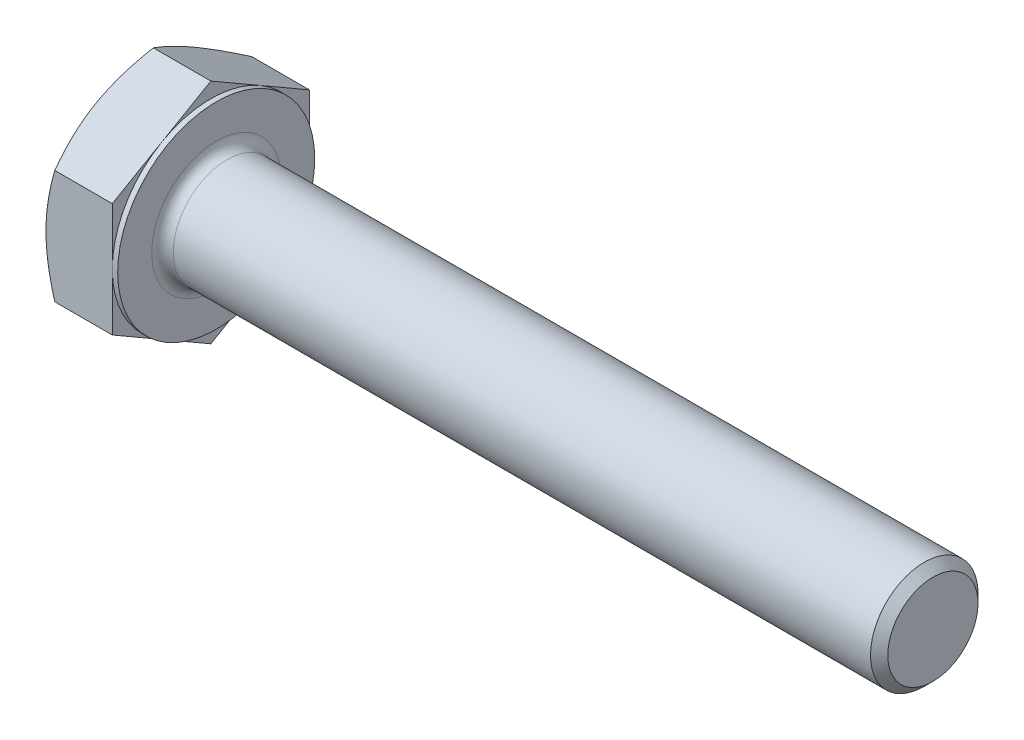
ISO-10303-21;
HEADER;
FILE_DESCRIPTION(('STEP AP214'),'2;1');
FILE_NAME('part.step','',(''),(''),'','','');
FILE_SCHEMA(('AUTOMOTIVE_DESIGN { 1 0 10303 214 1 1 1 1 }'));
ENDSEC;
DATA;
#1=APPLICATION_CONTEXT('core data for automotive mechanical design processes');
#2=APPLICATION_PROTOCOL_DEFINITION('international standard','automotive_design',2000,#1);
#3=PRODUCT_CONTEXT('',#1,'mechanical');
#4=PRODUCT('Part','Part','',(#3));
#5=PRODUCT_RELATED_PRODUCT_CATEGORY('part','',(#4));
#6=PRODUCT_DEFINITION_FORMATION('','',#4);
#7=PRODUCT_DEFINITION_CONTEXT('part definition',#1,'design');
#8=PRODUCT_DEFINITION('design','',#6,#7);
#9=PRODUCT_DEFINITION_SHAPE('','',#8);
#10=(LENGTH_UNIT() NAMED_UNIT(*) SI_UNIT(.MILLI.,.METRE.));
#11=(NAMED_UNIT(*) PLANE_ANGLE_UNIT() SI_UNIT($,.RADIAN.));
#12=(NAMED_UNIT(*) SI_UNIT($,.STERADIAN.) SOLID_ANGLE_UNIT());
#13=UNCERTAINTY_MEASURE_WITH_UNIT(LENGTH_MEASURE(1.E-05),#10,'distance_accuracy_value','');
#14=(GEOMETRIC_REPRESENTATION_CONTEXT(3) GLOBAL_UNCERTAINTY_ASSIGNED_CONTEXT((#13)) GLOBAL_UNIT_ASSIGNED_CONTEXT((#10,
#11,#12)) REPRESENTATION_CONTEXT('',''));
#15=CARTESIAN_POINT('',(0.,0.,0.));
#16=DIRECTION('',(0.,0.,1.));
#17=DIRECTION('',(1.,0.,0.));
#18=AXIS2_PLACEMENT_3D('',#15,#16,#17);
#19=CARTESIAN_POINT('',(8.,12.7017059221718,0.));
#20=DIRECTION('',(1.,0.,0.));
#21=DIRECTION('',(0.,0.,-1.));
#22=AXIS2_PLACEMENT_3D('',#19,#20,#21);
#23=PLANE('',#22);
#24=CARTESIAN_POINT('',(8.,0.,0.));
#25=DIRECTION('',(1.,0.,0.));
#26=DIRECTION('',(0.,0.,-1.));
#27=AXIS2_PLACEMENT_3D('',#24,#25,#26);
#28=CIRCLE('',#27,7.2);
#29=CARTESIAN_POINT('',(8.,0.,-7.2));
#30=VERTEX_POINT('',#29);
#31=EDGE_CURVE('E43',#30,#30,#28,.F.);
#32=ORIENTED_EDGE('',*,*,#31,.T.);
#33=EDGE_LOOP('',(#32));
#34=FACE_BOUND('',#33,.T.);
#35=CARTESIAN_POINT('',(8.,0.,0.));
#36=DIRECTION('',(1.,0.,0.));
#37=DIRECTION('',(0.,0.,-1.));
#38=AXIS2_PLACEMENT_3D('',#35,#36,#37);
#39=CIRCLE('',#38,11.);
#40=CARTESIAN_POINT('',(8.,0.,-11.));
#41=VERTEX_POINT('',#40);
#42=EDGE_CURVE('E294',#41,#41,#39,.T.);
#43=ORIENTED_EDGE('',*,*,#42,.T.);
#44=EDGE_LOOP('',(#43));
#45=FACE_BOUND('',#44,.T.);
#46=ADVANCED_FACE('F35',(#34,#45),#23,.T.);
#47=CARTESIAN_POINT('',(0.,0.,0.));
#48=DIRECTION('',(-1.,0.,0.));
#49=DIRECTION('',(0.,0.,1.));
#50=AXIS2_PLACEMENT_3D('',#47,#48,#49);
#51=CYLINDRICAL_SURFACE('',#50,6.);
#52=CARTESIAN_POINT('',(9.2,0.,0.));
#53=DIRECTION('',(1.,0.,0.));
#54=DIRECTION('',(0.,0.,-1.));
#55=AXIS2_PLACEMENT_3D('',#52,#53,#54);
#56=CIRCLE('',#55,6.);
#57=CARTESIAN_POINT('',(9.2,0.,-6.));
#58=VERTEX_POINT('',#57);
#59=EDGE_CURVE('E11',#58,#58,#56,.T.);
#60=ORIENTED_EDGE('',*,*,#59,.T.);
#61=EDGE_LOOP('',(#60));
#62=FACE_BOUND('',#61,.T.);
#63=CARTESIAN_POINT('',(87.036,0.,0.));
#64=DIRECTION('',(-1.,0.,0.));
#65=DIRECTION('',(0.,0.,1.));
#66=AXIS2_PLACEMENT_3D('',#63,#64,#65);
#67=CIRCLE('',#66,6.);
#68=CARTESIAN_POINT('',(87.036,0.,6.));
#69=VERTEX_POINT('',#68);
#70=EDGE_CURVE('E273',#69,#69,#67,.T.);
#71=ORIENTED_EDGE('',*,*,#70,.T.);
#72=EDGE_LOOP('',(#71));
#73=FACE_BOUND('',#72,.T.);
#74=ADVANCED_FACE('F247',(#62,#73),#51,.T.);
#75=CARTESIAN_POINT('',(88.,0.,0.));
#76=DIRECTION('',(-1.,0.,0.));
#77=DIRECTION('',(0.,0.,1.));
#78=AXIS2_PLACEMENT_3D('',#75,#76,#77);
#79=CONICAL_SURFACE('',#78,5.036,0.785398163397439);
#80=ORIENTED_EDGE('',*,*,#70,.F.);
#81=EDGE_LOOP('',(#80));
#82=FACE_BOUND('',#81,.T.);
#83=CARTESIAN_POINT('',(88.,0.,0.));
#84=DIRECTION('',(-1.,0.,0.));
#85=DIRECTION('',(0.,0.,1.));
#86=AXIS2_PLACEMENT_3D('',#83,#84,#85);
#87=CIRCLE('',#86,5.036);
#88=CARTESIAN_POINT('',(88.,0.,5.036));
#89=VERTEX_POINT('',#88);
#90=EDGE_CURVE('E271',#89,#89,#87,.T.);
#91=ORIENTED_EDGE('',*,*,#90,.T.);
#92=EDGE_LOOP('',(#91));
#93=FACE_BOUND('',#92,.T.);
#94=ADVANCED_FACE('F252',(#82,#93),#79,.T.);
#95=CARTESIAN_POINT('',(88.,0.,0.));
#96=DIRECTION('',(-1.,0.,0.));
#97=DIRECTION('',(0.,0.,1.));
#98=AXIS2_PLACEMENT_3D('',#95,#96,#97);
#99=PLANE('',#98);
#100=ORIENTED_EDGE('',*,*,#90,.F.);
#101=EDGE_LOOP('',(#100));
#102=FACE_BOUND('',#101,.T.);
#103=ADVANCED_FACE('F259',(#102),#99,.F.);
#104=CARTESIAN_POINT('',(7.4,11.,0.));
#105=DIRECTION('',(1.,0.,0.));
#106=DIRECTION('',(0.,0.,-1.));
#107=AXIS2_PLACEMENT_3D('',#104,#105,#106);
#108=PLANE('',#107);
#109=DIRECTION('',(0.,0.500000000000001,0.866025403784438));
#110=VECTOR('',#109,1.);
#111=CARTESIAN_POINT('',(7.4,6.35085296108587,-11.));
#112=LINE('',#111,#110);
#113=CARTESIAN_POINT('',(7.4,6.35085296108587,-11.));
#114=VERTEX_POINT('',#113);
#115=CARTESIAN_POINT('',(7.4,9.52627944162882,-5.50000000000001));
#116=VERTEX_POINT('',#115);
#117=EDGE_CURVE('E167',#114,#116,#112,.T.);
#118=ORIENTED_EDGE('',*,*,#117,.T.);
#119=CARTESIAN_POINT('',(7.4,0.,0.));
#120=DIRECTION('',(-1.,0.,0.));
#121=DIRECTION('',(0.,0.,1.));
#122=AXIS2_PLACEMENT_3D('',#119,#120,#121);
#123=CIRCLE('',#122,11.);
#124=CARTESIAN_POINT('',(7.4,0.,-11.));
#125=VERTEX_POINT('',#124);
#126=EDGE_CURVE('E50',#116,#125,#123,.T.);
#127=ORIENTED_EDGE('',*,*,#126,.T.);
#128=DIRECTION('',(0.,1.,0.));
#129=VECTOR('',#128,1.);
#130=CARTESIAN_POINT('',(7.4,6.35085296108587,-11.));
#131=LINE('',#130,#129);
#132=EDGE_CURVE('E297',#125,#114,#131,.T.);
#133=ORIENTED_EDGE('',*,*,#132,.T.);
#134=EDGE_LOOP('',(#118,#127,#133));
#135=FACE_BOUND('',#134,.T.);
#136=ADVANCED_FACE('F262',(#135),#108,.T.);
#137=CARTESIAN_POINT('',(7.4,12.7017059221718,0.));
#138=VERTEX_POINT('',#137);
#139=EDGE_CURVE('E165',#116,#138,#112,.T.);
#140=ORIENTED_EDGE('',*,*,#139,.T.);
#141=DIRECTION('',(0.,-0.500000000000001,0.866025403784438));
#142=VECTOR('',#141,1.);
#143=CARTESIAN_POINT('',(7.4,12.7017059221718,0.));
#144=LINE('',#143,#142);
#145=CARTESIAN_POINT('',(7.4,9.52627944162882,5.50000000000001));
#146=VERTEX_POINT('',#145);
#147=EDGE_CURVE('E164',#138,#146,#144,.T.);
#148=ORIENTED_EDGE('',*,*,#147,.T.);
#149=EDGE_CURVE('E153',#146,#116,#123,.T.);
#150=ORIENTED_EDGE('',*,*,#149,.T.);
#151=EDGE_LOOP('',(#140,#148,#150));
#152=FACE_BOUND('',#151,.T.);
#153=ADVANCED_FACE('F267',(#152),#108,.T.);
#154=CARTESIAN_POINT('',(7.4,6.35085296108588,11.));
#155=VERTEX_POINT('',#154);
#156=EDGE_CURVE('E132',#146,#155,#144,.T.);
#157=ORIENTED_EDGE('',*,*,#156,.T.);
#158=DIRECTION('',(0.,-1.,0.));
#159=VECTOR('',#158,1.);
#160=CARTESIAN_POINT('',(7.4,6.35085296108588,11.));
#161=LINE('',#160,#159);
#162=CARTESIAN_POINT('',(7.4,0.,11.));
#163=VERTEX_POINT('',#162);
#164=EDGE_CURVE('E126',#155,#163,#161,.T.);
#165=ORIENTED_EDGE('',*,*,#164,.T.);
#166=EDGE_CURVE('E130',#163,#146,#123,.T.);
#167=ORIENTED_EDGE('',*,*,#166,.T.);
#168=EDGE_LOOP('',(#157,#165,#167));
#169=FACE_BOUND('',#168,.T.);
#170=ADVANCED_FACE('F128',(#169),#108,.T.);
#171=CARTESIAN_POINT('',(7.4,-6.35085296108586,11.));
#172=VERTEX_POINT('',#171);
#173=EDGE_CURVE('E136',#163,#172,#161,.T.);
#174=ORIENTED_EDGE('',*,*,#173,.T.);
#175=DIRECTION('',(0.,-0.500000000000002,-0.866025403784438));
#176=VECTOR('',#175,1.);
#177=CARTESIAN_POINT('',(7.4,-12.7017059221718,0.));
#178=LINE('',#177,#176);
#179=CARTESIAN_POINT('',(7.4,-9.52627944162881,5.50000000000002));
#180=VERTEX_POINT('',#179);
#181=EDGE_CURVE('E143',#172,#180,#178,.T.);
#182=ORIENTED_EDGE('',*,*,#181,.T.);
#183=EDGE_CURVE('E140',#180,#163,#123,.T.);
#184=ORIENTED_EDGE('',*,*,#183,.T.);
#185=EDGE_LOOP('',(#174,#182,#184));
#186=FACE_BOUND('',#185,.T.);
#187=ADVANCED_FACE('F141',(#186),#108,.T.);
#188=CARTESIAN_POINT('',(7.4,-12.7017059221718,0.));
#189=VERTEX_POINT('',#188);
#190=EDGE_CURVE('E159',#180,#189,#178,.T.);
#191=ORIENTED_EDGE('',*,*,#190,.T.);
#192=DIRECTION('',(0.,0.5,-0.866025403784439));
#193=VECTOR('',#192,1.);
#194=CARTESIAN_POINT('',(7.4,-6.35085296108589,-11.));
#195=LINE('',#194,#193);
#196=CARTESIAN_POINT('',(7.4,-9.52627944162882,-5.5));
#197=VERTEX_POINT('',#196);
#198=EDGE_CURVE('E335',#189,#197,#195,.T.);
#199=ORIENTED_EDGE('',*,*,#198,.T.);
#200=EDGE_CURVE('E147',#197,#180,#123,.T.);
#201=ORIENTED_EDGE('',*,*,#200,.T.);
#202=EDGE_LOOP('',(#191,#199,#201));
#203=FACE_BOUND('',#202,.T.);
#204=ADVANCED_FACE('F336',(#203),#108,.T.);
#205=CARTESIAN_POINT('',(7.4,-6.35085296108589,-11.));
#206=VERTEX_POINT('',#205);
#207=EDGE_CURVE('E154',#197,#206,#195,.T.);
#208=ORIENTED_EDGE('',*,*,#207,.T.);
#209=EDGE_CURVE('E298',#206,#125,#131,.T.);
#210=ORIENTED_EDGE('',*,*,#209,.T.);
#211=EDGE_CURVE('E305',#125,#197,#123,.T.);
#212=ORIENTED_EDGE('',*,*,#211,.T.);
#213=EDGE_LOOP('',(#208,#210,#212));
#214=FACE_BOUND('',#213,.T.);
#215=ADVANCED_FACE('F268',(#214),#108,.T.);
#216=CARTESIAN_POINT('',(0.,0.,0.));
#217=DIRECTION('',(-1.,0.,0.));
#218=DIRECTION('',(0.,0.,1.));
#219=AXIS2_PLACEMENT_3D('',#216,#217,#218);
#220=CYLINDRICAL_SURFACE('',#219,11.);
#221=ORIENTED_EDGE('',*,*,#126,.F.);
#222=ORIENTED_EDGE('',*,*,#149,.F.);
#223=ORIENTED_EDGE('',*,*,#166,.F.);
#224=ORIENTED_EDGE('',*,*,#183,.F.);
#225=ORIENTED_EDGE('',*,*,#200,.F.);
#226=ORIENTED_EDGE('',*,*,#211,.F.);
#227=EDGE_LOOP('',(#221,#222,#223,#224,#225,#226));
#228=FACE_BOUND('',#227,.T.);
#229=ORIENTED_EDGE('',*,*,#42,.F.);
#230=EDGE_LOOP('',(#229));
#231=FACE_BOUND('',#230,.T.);
#232=ADVANCED_FACE('F150',(#228,#231),#220,.T.);
#233=CARTESIAN_POINT('',(0.,12.7017059221718,0.));
#234=DIRECTION('',(1.,0.,0.));
#235=DIRECTION('',(0.,0.,-1.));
#236=AXIS2_PLACEMENT_3D('',#233,#234,#235);
#237=PLANE('',#236);
#238=CARTESIAN_POINT('',(0.,0.,0.));
#239=DIRECTION('',(1.,0.,0.));
#240=DIRECTION('',(0.,0.,-1.));
#241=AXIS2_PLACEMENT_3D('',#238,#239,#240);
#242=CIRCLE('',#241,11.);
#243=CARTESIAN_POINT('',(0.,0.,-11.));
#244=VERTEX_POINT('',#243);
#245=CARTESIAN_POINT('',(0.,9.52627944162882,-5.50000000000001));
#246=VERTEX_POINT('',#245);
#247=EDGE_CURVE('E293',#244,#246,#242,.T.);
#248=ORIENTED_EDGE('',*,*,#247,.F.);
#249=CARTESIAN_POINT('',(0.,-9.52627944162883,-5.5));
#250=VERTEX_POINT('',#249);
#251=EDGE_CURVE('E289',#250,#244,#242,.T.);
#252=ORIENTED_EDGE('',*,*,#251,.F.);
#253=CARTESIAN_POINT('',(0.,-9.52627944162881,5.50000000000002));
#254=VERTEX_POINT('',#253);
#255=EDGE_CURVE('E292',#254,#250,#242,.T.);
#256=ORIENTED_EDGE('',*,*,#255,.F.);
#257=CARTESIAN_POINT('',(0.,0.,11.));
#258=VERTEX_POINT('',#257);
#259=EDGE_CURVE('E328',#258,#254,#242,.T.);
#260=ORIENTED_EDGE('',*,*,#259,.F.);
#261=CARTESIAN_POINT('',(0.,0.,0.));
#262=DIRECTION('',(-1.,0.,0.));
#263=DIRECTION('',(0.,0.,1.));
#264=AXIS2_PLACEMENT_3D('',#261,#262,#263);
#265=CIRCLE('',#264,11.);
#266=CARTESIAN_POINT('',(0.,9.52627944162882,5.50000000000001));
#267=VERTEX_POINT('',#266);
#268=EDGE_CURVE('E168',#258,#267,#265,.T.);
#269=ORIENTED_EDGE('',*,*,#268,.T.);
#270=EDGE_CURVE('E351',#246,#267,#242,.T.);
#271=ORIENTED_EDGE('',*,*,#270,.F.);
#272=EDGE_LOOP('',(#248,#252,#256,#260,#269,#271));
#273=FACE_BOUND('',#272,.T.);
#274=ADVANCED_FACE('F197',(#273),#237,.F.);
#275=CARTESIAN_POINT('',(0.,0.,0.));
#276=DIRECTION('',(1.,0.,0.));
#277=DIRECTION('',(0.,0.,-1.));
#278=AXIS2_PLACEMENT_3D('',#275,#276,#277);
#279=CONICAL_SURFACE('',#278,11.,1.0471975511966);
#280=CARTESIAN_POINT('',(0.982547039823191,6.35073749103204,11.0002));
#281=CARTESIAN_POINT('',(0.901959155335525,6.49034297195856,10.7583962140202));
#282=CARTESIAN_POINT('',(0.825028921497374,6.63046897390005,10.515690859196));
#283=CARTESIAN_POINT('',(0.679498643319587,6.91184468290416,10.0283338351852));
#284=CARTESIAN_POINT('',(0.610901338761565,7.05309474336861,9.78368155388858));
#285=CARTESIAN_POINT('',(0.418936354542192,7.47912088225752,9.0457826359806));
#286=CARTESIAN_POINT('',(0.309747721904761,7.7655787550001,8.54962304616236));
#287=CARTESIAN_POINT('',(0.181714117195322,8.19424982761043,7.80714296866621));
#288=CARTESIAN_POINT('',(0.145242204444723,8.33518236221488,7.56304065829185));
#289=CARTESIAN_POINT('',(0.0840813064430235,8.61769996304406,7.07370581962324));
#290=CARTESIAN_POINT('',(0.0593925479828354,8.75928504177541,6.82847326966692));
#291=CARTESIAN_POINT('',(0.0224303476738595,9.04269125210811,6.33759931419013));
#292=CARTESIAN_POINT('',(0.0101421523103371,9.18451190164691,6.0919587436265));
#293=CARTESIAN_POINT('',(-0.00175707301040475,9.468284615191,5.60044998596645));
#294=CARTESIAN_POINT('',(-0.00136849465552234,9.61023667500044,5.35458180613745));
#295=CARTESIAN_POINT('',(0.0112011693743153,9.87561687613281,4.89492981445334));
#296=CARTESIAN_POINT('',(0.0218490320051213,9.99906394230749,4.68111322379348));
#297=CARTESIAN_POINT('',(0.0525316277921012,10.2456741483142,4.25397181732485));
#298=CARTESIAN_POINT('',(0.0725670249420614,10.3688372674429,4.04064703737531));
#299=CARTESIAN_POINT('',(0.121675385698741,10.6148126455581,3.6146051850688));
#300=CARTESIAN_POINT('',(0.150755814007044,10.7376245298813,3.4018887616477));
#301=CARTESIAN_POINT('',(0.217443999362303,10.9826725251415,2.97745318356423));
#302=CARTESIAN_POINT('',(0.25505233601821,11.1049085963659,2.76573409768589));
#303=CARTESIAN_POINT('',(0.381619916344573,11.4759630865849,2.12304886825007));
#304=CARTESIAN_POINT('',(0.483199458479366,11.7237069719422,1.69394387154657));
#305=CARTESIAN_POINT('',(0.713743699662927,12.2155005006248,0.842132493034879));
#306=CARTESIAN_POINT('',(0.84265425180754,12.4595564409434,0.419415204514));
#307=CARTESIAN_POINT('',(0.982547039823199,12.7018213922256,-0.000199999999999214));
#308=B_SPLINE_CURVE_WITH_KNOTS('',3,(#280,#281,#282,#283,#284,#285,#286,#287,#288,#289,#290,
#291,#292,#293,#294,#295,#296,#297,#298,#299,#300,#301,#302,#303,#304,#305,#306,#307),
.UNSPECIFIED.,.F.,.F.,(4,2,2,2,2,2,2,2,2,2,2,2,2,4),(0.,0.871755124656707,1.74379610209014,
3.49159027742165,4.34403665487447,5.19649943874035,6.0479468088217,6.89936787084372,
7.64056020263244,8.38180496793424,9.1236630996721,9.86557166775903,11.3820155381851,
12.8954827156567),.UNSPECIFIED.);
#309=CARTESIAN_POINT('',(0.98248037224745,12.7017059221718,0.));
#310=VERTEX_POINT('',#309);
#311=EDGE_CURVE('E216',#267,#310,#308,.T.);
#312=ORIENTED_EDGE('',*,*,#311,.T.);
#313=CARTESIAN_POINT('',(0.9825470398232,12.7018213922256,0.0002));
#314=CARTESIAN_POINT('',(0.901959155335534,12.5622159112991,-0.241603785979829));
#315=CARTESIAN_POINT('',(0.825028921497383,12.4220899093576,-0.484309140803984));
#316=CARTESIAN_POINT('',(0.679498643319595,12.1407142003535,-0.971666164814806));
#317=CARTESIAN_POINT('',(0.610901338761574,11.999464139889,-1.21631844611142));
#318=CARTESIAN_POINT('',(0.418936354542199,11.5734380010001,-1.9542173640194));
#319=CARTESIAN_POINT('',(0.309747721904765,11.2869801282576,-2.45037695383764));
#320=CARTESIAN_POINT('',(0.181714117195326,10.8583090556472,-3.19285703133379));
#321=CARTESIAN_POINT('',(0.145242204444727,10.7173765210428,-3.43695934170814));
#322=CARTESIAN_POINT('',(0.0840813064430262,10.4348589202136,-3.92629418037676));
#323=CARTESIAN_POINT('',(0.0593925479828372,10.2932738414822,-4.17152673033309));
#324=CARTESIAN_POINT('',(0.0224303476738606,10.0098676311495,-4.66240068580987));
#325=CARTESIAN_POINT('',(0.0101421523103383,9.86804698161074,-4.9080412563735));
#326=CARTESIAN_POINT('',(-0.00175707301040444,9.58427426806665,-5.39955001403355));
#327=CARTESIAN_POINT('',(-0.00136849465552313,9.44232220825721,-5.64541819386255));
#328=CARTESIAN_POINT('',(0.0112011693743136,9.17694200712484,-6.10507018554666));
#329=CARTESIAN_POINT('',(0.0218490320051198,9.05349494095016,-6.31888677620652));
#330=CARTESIAN_POINT('',(0.0525316277920992,8.80688473494347,-6.74602818267515));
#331=CARTESIAN_POINT('',(0.0725670249420589,8.68372161581478,-6.95935296262469));
#332=CARTESIAN_POINT('',(0.121675385698738,8.43774623769957,-7.3853948149312));
#333=CARTESIAN_POINT('',(0.15075581400704,8.31493435337634,-7.5981112383523));
#334=CARTESIAN_POINT('',(0.217443999362299,8.06988635811619,-8.02254681643577));
#335=CARTESIAN_POINT('',(0.255052336018205,7.94765028689175,-8.23426590231411));
#336=CARTESIAN_POINT('',(0.381619916344568,7.57659579667278,-8.87695113174993));
#337=CARTESIAN_POINT('',(0.483199458479359,7.32885191131541,-9.30605612845343));
#338=CARTESIAN_POINT('',(0.713743699662918,6.83705838263289,-10.1578675069651));
#339=CARTESIAN_POINT('',(0.842654251807531,6.59300244231425,-10.580584795486));
#340=CARTESIAN_POINT('',(0.982547039823192,6.35073749103204,-11.0002));
#341=B_SPLINE_CURVE_WITH_KNOTS('',3,(#313,#314,#315,#316,#317,#318,#319,#320,#321,#322,#323,
#324,#325,#326,#327,#328,#329,#330,#331,#332,#333,#334,#335,#336,#337,#338,#339,#340),
.UNSPECIFIED.,.F.,.F.,(4,2,2,2,2,2,2,2,2,2,2,2,2,4),(0.,0.871755124656707,1.74379610209014,
3.49159027742166,4.34403665487447,5.19649943874036,6.0479468088217,6.89936787084373,
7.64056020263245,8.38180496793425,9.12366309967211,9.86557166775903,11.3820155381851,
12.8954827156567),.UNSPECIFIED.);
#342=EDGE_CURVE('E58',#310,#246,#341,.T.);
#343=ORIENTED_EDGE('',*,*,#342,.T.);
#344=ORIENTED_EDGE('',*,*,#270,.T.);
#345=EDGE_LOOP('',(#312,#343,#344));
#346=FACE_BOUND('',#345,.T.);
#347=ADVANCED_FACE('F352',(#346),#279,.T.);
#348=CARTESIAN_POINT('',(5.45962897935432,-17.2470997850768,11.));
#349=CARTESIAN_POINT('',(5.34231348623165,-17.0060889518646,11.));
#350=CARTESIAN_POINT('',(5.22556892482358,-16.7648003390627,11.));
#351=CARTESIAN_POINT('',(4.99335060595058,-16.2816096545103,11.));
#352=CARTESIAN_POINT('',(4.87787686070189,-16.03970757689,11.));
#353=CARTESIAN_POINT('',(4.5335260225219,-15.3129324281348,11.));
#354=CARTESIAN_POINT('',(4.30675273072213,-14.8270588812377,11.));
#355=CARTESIAN_POINT('',(3.85897116853181,-13.8495672244361,11.));
#356=CARTESIAN_POINT('',(3.63799941464739,-13.3579323474887,11.));
#357=CARTESIAN_POINT('',(3.20484722410655,-12.3708181940388,11.));
#358=CARTESIAN_POINT('',(2.99266638443466,-11.875339095012,11.));
#359=CARTESIAN_POINT('',(2.57247367919091,-10.8630233950126,11.));
#360=CARTESIAN_POINT('',(2.36484130082578,-10.3460284712597,11.));
#361=CARTESIAN_POINT('',(1.96483982306432,-9.30605625666137,11.));
#362=CARTESIAN_POINT('',(1.77247241026768,-8.78307831204595,11.));
#363=CARTESIAN_POINT('',(1.40791696455449,-7.73124436817154,11.));
#364=CARTESIAN_POINT('',(1.23568964638714,-7.2024020922387,11.));
#365=CARTESIAN_POINT('',(0.91680574828924,-6.13708404570501,11.));
#366=CARTESIAN_POINT('',(0.770141309994957,-5.60061067604935,11.));
#367=CARTESIAN_POINT('',(0.574935442743972,-4.79156898952362,11.));
#368=CARTESIAN_POINT('',(0.514137021876882,-4.52194135151204,11.));
#369=CARTESIAN_POINT('',(0.401508435345234,-3.98080971915151,11.));
#370=CARTESIAN_POINT('',(0.349678094887422,-3.70930576148044,11.));
#371=CARTESIAN_POINT('',(0.255888593165524,-3.16459510241603,11.));
#372=CARTESIAN_POINT('',(0.213929236462788,-2.89138843484512,11.));
#373=CARTESIAN_POINT('',(0.140711189296341,-2.34354612758117,11.));
#374=CARTESIAN_POINT('',(0.109452068415435,-2.06891054581749,11.));
#375=CARTESIAN_POINT('',(0.0586581415230971,-1.52226131984006,11.));
#376=CARTESIAN_POINT('',(0.0389718884451943,-1.25026183527092,11.));
#377=CARTESIAN_POINT('',(0.0111284010141502,-0.705673996301283,11.));
#378=CARTESIAN_POINT('',(0.00297097006206761,-0.433085652021906,11.));
#379=CARTESIAN_POINT('',(-0.0016198739465194,0.112191853840743,11.));
#380=CARTESIAN_POINT('',(0.00194669894006209,0.384881015302746,11.));
#381=CARTESIAN_POINT('',(0.0207143970443333,0.929861561068674,11.));
#382=CARTESIAN_POINT('',(0.0359160573832307,1.20215292650004,11.));
#383=CARTESIAN_POINT('',(0.0856729787465039,1.85095047440591,11.));
#384=CARTESIAN_POINT('',(0.125437121633999,2.22706614776121,11.));
#385=CARTESIAN_POINT('',(0.225037478525136,2.97661036121123,11.));
#386=CARTESIAN_POINT('',(0.284876266728091,3.35003855041006,11.));
#387=CARTESIAN_POINT('',(0.491340522059922,4.46580768665092,11.));
#388=CARTESIAN_POINT('',(0.664879654325623,5.20324026094175,11.));
#389=CARTESIAN_POINT('',(0.96714399211498,6.3061295691042,11.));
#390=CARTESIAN_POINT('',(1.07633089919387,6.67727137954583,11.));
#391=CARTESIAN_POINT('',(1.30638118501142,7.41595393527288,11.));
#392=CARTESIAN_POINT('',(1.42724464423454,7.78349465571738,11.));
#393=CARTESIAN_POINT('',(1.67868115165415,8.51508385863158,11.));
#394=CARTESIAN_POINT('',(1.80925124223601,8.87913336701398,11.));
#395=CARTESIAN_POINT('',(2.07853139559134,9.60419404051376,11.));
#396=CARTESIAN_POINT('',(2.21724134094991,9.96520524937182,11.));
#397=CARTESIAN_POINT('',(2.56570983011627,10.8471449233791,11.));
#398=CARTESIAN_POINT('',(2.7792374206319,11.366581815061,11.));
#399=CARTESIAN_POINT('',(3.21741982618343,12.4007561844022,11.));
#400=CARTESIAN_POINT('',(3.44207546585639,12.9154933104307,11.));
#401=CARTESIAN_POINT('',(3.90018345618556,13.9411926358306,11.));
#402=CARTESIAN_POINT('',(4.13363815526232,14.452153783265,11.));
#403=CARTESIAN_POINT('',(4.60748399230414,15.4708244590252,11.));
#404=CARTESIAN_POINT('',(4.84787494923999,15.9785340717909,11.));
#405=CARTESIAN_POINT('',(5.33454416659782,16.991900203434,11.));
#406=CARTESIAN_POINT('',(5.58082941367991,17.4975533606732,11.));
#407=CARTESIAN_POINT('',(6.07795337147829,18.5066162614648,11.));
#408=CARTESIAN_POINT('',(6.3287921061177,19.0100259932134,11.));
#409=CARTESIAN_POINT('',(6.83417262370027,20.0148835366254,11.));
#410=CARTESIAN_POINT('',(7.0887138275232,20.5163316398723,11.));
#411=CARTESIAN_POINT('',(7.60090805557973,21.5176369665699,11.));
#412=CARTESIAN_POINT('',(7.85856109256177,22.0174941834924,11.));
#413=CARTESIAN_POINT('',(8.58894371196248,23.425462327732,11.));
#414=CARTESIAN_POINT('',(9.06467784043081,24.3320145304321,11.));
#415=CARTESIAN_POINT('',(10.0225256617149,26.1417834952498,11.));
#416=CARTESIAN_POINT('',(10.5046396248099,27.04500011397,11.));
#417=CARTESIAN_POINT('',(11.4723649577538,28.8463130553615,11.));
#418=CARTESIAN_POINT('',(11.9579628331135,29.744416632715,11.));
#419=CARTESIAN_POINT('',(12.6891583734937,31.0900134257858,11.));
#420=CARTESIAN_POINT('',(12.9333491720225,31.5382722573939,11.));
#421=CARTESIAN_POINT('',(13.4225690770987,32.4343313922787,11.));
#422=CARTESIAN_POINT('',(13.6675981823792,32.882131696247,11.));
#423=CARTESIAN_POINT('',(13.9129970850526,33.3297293129898,11.));
#424=B_SPLINE_CURVE_WITH_KNOTS('',3,(#348,#349,#350,#351,#352,#353,#354,#355,#356,#357,#358,
#359,#360,#361,#362,#363,#364,#365,#366,#367,#368,#369,#370,#371,#372,#373,#374,#375,#376,#377,
#378,#379,#380,#381,#382,#383,#384,#385,#386,#387,#388,#389,#390,#391,#392,#393,#394,#395,#396,
#397,#398,#399,#400,#401,#402,#403,#404,#405,#406,#407,#408,#409,#410,#411,#412,#413,#414,#415,
#416,#417,#418,#419,#420,#421,#422,#423),.UNSPECIFIED.,.F.,.F.,(4,2,2,2,2,2,2,2,2,2,2,2,2,2,2,2,
2,2,2,2,2,2,2,2,2,2,2,2,2,2,2,2,2,2,2,2,2,4),(0.,0.804139336623751,1.60828639662063,
3.21680897448121,4.83377623759865,6.45066928937426,8.12187818876223,9.7932714807813,
11.4613481630707,13.1289111488456,13.9579782914284,14.7870292731757,15.6160638389051,
16.445065052783,17.2629611429282,18.0808432854694,18.8987244473819,19.716643227564,
20.8506417292814,21.9847857008002,24.2542515847469,25.4147583491649,26.575273113328,
27.7354357061756,28.8955815681455,30.5802397695547,32.2650229988083,33.9502591165867,
35.6354512911452,37.3227509574432,39.0100594910421,40.6971068839486,42.3841611906352,
45.4555127256885,48.5269947965539,51.5899154254046,53.1212821755916,54.652646612437),.UNSPECIFIED.);
#425=CARTESIAN_POINT('',(0.98248037224744,6.35085296108588,11.));
#426=VERTEX_POINT('',#425);
#427=EDGE_CURVE('E228',#258,#426,#424,.T.);
#428=ORIENTED_EDGE('',*,*,#427,.T.);
#429=EDGE_CURVE('E227',#426,#267,#308,.T.);
#430=ORIENTED_EDGE('',*,*,#429,.T.);
#431=ORIENTED_EDGE('',*,*,#268,.F.);
#432=EDGE_LOOP('',(#428,#430,#431));
#433=FACE_BOUND('',#432,.T.);
#434=ADVANCED_FACE('F322',(#433),#279,.T.);
#435=CARTESIAN_POINT('',(0.982480372247436,-6.35085296108586,11.));
#436=VERTEX_POINT('',#435);
#437=EDGE_CURVE('E274',#436,#258,#424,.T.);
#438=ORIENTED_EDGE('',*,*,#437,.T.);
#439=ORIENTED_EDGE('',*,*,#259,.T.);
#440=CARTESIAN_POINT('',(0.982547039823196,-12.7018213922256,-0.000200000000000038));
#441=CARTESIAN_POINT('',(0.901959155335529,-12.5622159112991,0.241603785979828));
#442=CARTESIAN_POINT('',(0.825028921497378,-12.4220899093576,0.484309140803982));
#443=CARTESIAN_POINT('',(0.679498643319591,-12.1407142003535,0.971666164814804));
#444=CARTESIAN_POINT('',(0.610901338761569,-11.999464139889,1.21631844611141));
#445=CARTESIAN_POINT('',(0.418936354542195,-11.5734380010001,1.9542173640194));
#446=CARTESIAN_POINT('',(0.309747721904761,-11.2869801282575,2.45037695383764));
#447=CARTESIAN_POINT('',(0.181714117195321,-10.8583090556472,3.19285703133378));
#448=CARTESIAN_POINT('',(0.145242204444722,-10.7173765210428,3.43695934170814));
#449=CARTESIAN_POINT('',(0.0840813064430204,-10.4348589202136,3.92629418037675));
#450=CARTESIAN_POINT('',(0.0593925479828312,-10.2932738414822,4.17152673033308));
#451=CARTESIAN_POINT('',(0.0224303476738547,-10.0098676311495,4.66240068580987));
#452=CARTESIAN_POINT('',(0.0101421523103328,-9.86804698161073,4.9080412563735));
#453=CARTESIAN_POINT('',(-0.00175707301040996,-9.58427426806664,5.39955001403354));
#454=CARTESIAN_POINT('',(-0.00136849465552902,-9.4423222082572,5.64541819386254));
#455=CARTESIAN_POINT('',(0.0112011693743066,-9.17694200712483,6.10507018554666));
#456=CARTESIAN_POINT('',(0.021849032005112,-9.05349494095015,6.31888677620652));
#457=CARTESIAN_POINT('',(0.0525316277920915,-8.80688473494345,6.74602818267514));
#458=CARTESIAN_POINT('',(0.0725670249420518,-8.68372161581477,6.95935296262468));
#459=CARTESIAN_POINT('',(0.121675385698731,-8.43774623769956,7.3853948149312));
#460=CARTESIAN_POINT('',(0.150755814007034,-8.31493435337633,7.5981112383523));
#461=CARTESIAN_POINT('',(0.217443999362292,-8.06988635811618,8.02254681643577));
#462=CARTESIAN_POINT('',(0.255052336018197,-7.94765028689174,8.23426590231411));
#463=CARTESIAN_POINT('',(0.381619916344559,-7.57659579667277,8.87695113174993));
#464=CARTESIAN_POINT('',(0.483199458479352,-7.32885191131539,9.30605612845342));
#465=CARTESIAN_POINT('',(0.713743699662913,-6.83705838263288,10.1578675069651));
#466=CARTESIAN_POINT('',(0.842654251807526,-6.59300244231424,10.580584795486));
#467=CARTESIAN_POINT('',(0.982547039823186,-6.35073749103202,11.0002));
#468=B_SPLINE_CURVE_WITH_KNOTS('',3,(#440,#441,#442,#443,#444,#445,#446,#447,#448,#449,#450,
#451,#452,#453,#454,#455,#456,#457,#458,#459,#460,#461,#462,#463,#464,#465,#466,#467),
.UNSPECIFIED.,.F.,.F.,(4,2,2,2,2,2,2,2,2,2,2,2,2,4),(0.,0.871755124656706,1.74379610209014,
3.49159027742165,4.34403665487447,5.19649943874035,6.0479468088217,6.89936787084372,
7.64056020263245,8.38180496793425,9.12366309967211,9.86557166775903,11.3820155381851,
12.8954827156567),.UNSPECIFIED.);
#469=EDGE_CURVE('E218',#254,#436,#468,.T.);
#470=ORIENTED_EDGE('',*,*,#469,.T.);
#471=EDGE_LOOP('',(#438,#439,#470));
#472=FACE_BOUND('',#471,.T.);
#473=ADVANCED_FACE('F186',(#472),#279,.T.);
#474=CARTESIAN_POINT('',(0.982480372247447,-12.7017059221718,0.));
#475=VERTEX_POINT('',#474);
#476=EDGE_CURVE('E211',#475,#254,#468,.T.);
#477=ORIENTED_EDGE('',*,*,#476,.T.);
#478=ORIENTED_EDGE('',*,*,#255,.T.);
#479=CARTESIAN_POINT('',(0.982547039823196,-6.35073749103205,-11.0002));
#480=CARTESIAN_POINT('',(0.90195915533553,-6.49034297195858,-10.7583962140202));
#481=CARTESIAN_POINT('',(0.82502892149738,-6.63046897390007,-10.515690859196));
#482=CARTESIAN_POINT('',(0.679498643319592,-6.91184468290417,-10.0283338351852));
#483=CARTESIAN_POINT('',(0.61090133876157,-7.05309474336862,-9.78368155388858));
#484=CARTESIAN_POINT('',(0.418936354542196,-7.47912088225753,-9.0457826359806));
#485=CARTESIAN_POINT('',(0.309747721904764,-7.76557875500011,-8.54962304616236));
#486=CARTESIAN_POINT('',(0.181714117195326,-8.19424982761044,-7.80714296866621));
#487=CARTESIAN_POINT('',(0.145242204444727,-8.33518236221489,-7.56304065829185));
#488=CARTESIAN_POINT('',(0.0840813064430265,-8.61769996304407,-7.07370581962324));
#489=CARTESIAN_POINT('',(0.0593925479828378,-8.75928504177542,-6.82847326966691));
#490=CARTESIAN_POINT('',(0.0224303476738616,-9.04269125210812,-6.33759931419012));
#491=CARTESIAN_POINT('',(0.0101421523103395,-9.18451190164692,-6.09195874362649));
#492=CARTESIAN_POINT('',(-0.00175707301040221,-9.46828461519101,-5.60044998596645));
#493=CARTESIAN_POINT('',(-0.00136849465552012,-9.61023667500044,-5.35458180613745));
#494=CARTESIAN_POINT('',(0.0112011693743166,-9.87561687613281,-4.89492981445333));
#495=CARTESIAN_POINT('',(0.0218490320051222,-9.99906394230749,-4.68111322379347));
#496=CARTESIAN_POINT('',(0.0525316277921022,-10.2456741483142,-4.25397181732485));
#497=CARTESIAN_POINT('',(0.072567024942063,-10.3688372674429,-4.04064703737531));
#498=CARTESIAN_POINT('',(0.121675385698743,-10.6148126455581,-3.6146051850688));
#499=CARTESIAN_POINT('',(0.150755814007045,-10.7376245298813,-3.4018887616477));
#500=CARTESIAN_POINT('',(0.217443999362303,-10.9826725251415,-2.97745318356422));
#501=CARTESIAN_POINT('',(0.255052336018209,-11.1049085963659,-2.76573409768589));
#502=CARTESIAN_POINT('',(0.381619916344572,-11.4759630865849,-2.12304886825007));
#503=CARTESIAN_POINT('',(0.483199458479365,-11.7237069719422,-1.69394387154657));
#504=CARTESIAN_POINT('',(0.713743699662925,-12.2155005006248,-0.842132493034879));
#505=CARTESIAN_POINT('',(0.842654251807537,-12.4595564409434,-0.419415204514001));
#506=CARTESIAN_POINT('',(0.982547039823196,-12.7018213922256,0.000199999999999387));
#507=B_SPLINE_CURVE_WITH_KNOTS('',3,(#479,#480,#481,#482,#483,#484,#485,#486,#487,#488,#489,
#490,#491,#492,#493,#494,#495,#496,#497,#498,#499,#500,#501,#502,#503,#504,#505,#506),
.UNSPECIFIED.,.F.,.F.,(4,2,2,2,2,2,2,2,2,2,2,2,2,4),(0.,0.871755124656708,1.74379610209014,
3.49159027742166,4.34403665487447,5.19649943874035,6.0479468088217,6.89936787084373,
7.64056020263245,8.38180496793424,9.1236630996721,9.86557166775902,11.3820155381851,
12.8954827156567),.UNSPECIFIED.);
#508=EDGE_CURVE('E217',#250,#475,#507,.T.);
#509=ORIENTED_EDGE('',*,*,#508,.T.);
#510=EDGE_LOOP('',(#477,#478,#509));
#511=FACE_BOUND('',#510,.T.);
#512=ADVANCED_FACE('F350',(#511),#279,.T.);
#513=CARTESIAN_POINT('',(0.982480372247442,6.35085296108587,-11.));
#514=VERTEX_POINT('',#513);
#515=EDGE_CURVE('E219',#246,#514,#341,.T.);
#516=ORIENTED_EDGE('',*,*,#515,.T.);
#517=CARTESIAN_POINT('',(5.45962897683115,-17.2470997798933,-11.));
#518=CARTESIAN_POINT('',(5.3423134837611,-17.0060889467683,-11.));
#519=CARTESIAN_POINT('',(5.22556892240561,-16.7648003340536,-11.));
#520=CARTESIAN_POINT('',(4.99335060363771,-16.2816096496756,-11.));
#521=CARTESIAN_POINT('',(4.87787685844152,-16.0397075721426,-11.));
#522=CARTESIAN_POINT('',(4.53352602041888,-15.3129324236495,-11.));
#523=CARTESIAN_POINT('',(4.30675272872375,-14.8270588769274,-11.));
#524=CARTESIAN_POINT('',(3.85897116674279,-13.8495672204784,-11.));
#525=CARTESIAN_POINT('',(3.63799941296306,-13.3579323437087,-11.));
#526=CARTESIAN_POINT('',(3.20484722262988,-12.3708181906152,-11.));
#527=CARTESIAN_POINT('',(2.99266638306095,-11.8753390917673,-11.));
#528=CARTESIAN_POINT('',(2.57247367802624,-10.8630233921397,-11.));
#529=CARTESIAN_POINT('',(2.36484129976693,-10.3460284685799,-11.));
#530=CARTESIAN_POINT('',(1.96483982221148,-9.30605625437088,-11.));
#531=CARTESIAN_POINT('',(1.77247240951503,-8.78307830995168,-11.));
#532=CARTESIAN_POINT('',(1.40791696399265,-7.73124436647331,-11.));
#533=CARTESIAN_POINT('',(1.23568964591595,-7.20240209074028,-11.));
#534=CARTESIAN_POINT('',(0.916805747984619,-6.13708404461173,-11.));
#535=CARTESIAN_POINT('',(0.77014130976626,-5.60061067516138,-11.));
#536=CARTESIAN_POINT('',(0.57493544262423,-4.79156898899759,-11.));
#537=CARTESIAN_POINT('',(0.514137021797096,-4.52194135114064,-11.));
#538=CARTESIAN_POINT('',(0.401508435335246,-3.98080971909158,-11.));
#539=CARTESIAN_POINT('',(0.349678094907276,-3.70930576157735,-11.));
#540=CARTESIAN_POINT('',(0.255888593233352,-3.16459510282835,-11.));
#541=CARTESIAN_POINT('',(0.213929236548754,-2.89138843541601,-11.));
#542=CARTESIAN_POINT('',(0.140711189405543,-2.34354612847057,-11.));
#543=CARTESIAN_POINT('',(0.109452068529736,-2.06891054686683,-11.));
#544=CARTESIAN_POINT('',(0.0586581416334424,-1.52226132120592,-11.));
#545=CARTESIAN_POINT('',(0.0389718885467467,-1.25026183679334,-11.));
#546=CARTESIAN_POINT('',(0.0111284010842726,-0.705673998136546,-11.));
#547=CARTESIAN_POINT('',(0.00297097010955307,-0.433085654013441,-11.));
#548=CARTESIAN_POINT('',(-0.00161987395784271,0.11219185153782,-11.));
#549=CARTESIAN_POINT('',(0.00194669889256435,0.384881012844706,-11.));
#550=CARTESIAN_POINT('',(0.0207143969119022,0.929861558302418,-11.));
#551=CARTESIAN_POINT('',(0.0359160572020394,1.20215292358069,-11.));
#552=CARTESIAN_POINT('',(0.0856729784453964,1.85095047125051,-11.));
#553=CARTESIAN_POINT('',(0.125437121263892,2.22706614452355,-11.));
#554=CARTESIAN_POINT('',(0.225037478013344,2.97661035781277,-11.));
#555=CARTESIAN_POINT('',(0.284876266143613,3.35003854693308,-11.));
#556=CARTESIAN_POINT('',(0.491340521255872,4.46580768294265,-11.));
#557=CARTESIAN_POINT('',(0.664879653373268,5.20324025708537,-11.));
#558=CARTESIAN_POINT('',(0.967143990943863,6.30612956502636,-11.));
#559=CARTESIAN_POINT('',(1.07633089794937,6.67727137539264,-11.));
#560=CARTESIAN_POINT('',(1.3063811836224,7.41595393096985,-11.));
#561=CARTESIAN_POINT('',(1.42724464277439,7.78349465133984,-11.));
#562=CARTESIAN_POINT('',(1.67868115005429,8.51508385410558,-11.));
#563=CARTESIAN_POINT('',(1.80925124056757,8.87913336241403,-11.));
#564=CARTESIAN_POINT('',(2.07853139378813,9.60419403576588,-11.));
#565=CARTESIAN_POINT('',(2.21724133908051,9.96520524454998,-11.));
#566=CARTESIAN_POINT('',(2.5657098281399,10.8471449185089,-11.));
#567=CARTESIAN_POINT('',(2.77923741861963,11.3665818102149,-11.));
#568=CARTESIAN_POINT('',(3.21741982410827,12.4007561796013,-11.));
#569=CARTESIAN_POINT('',(3.44207546375422,12.915493305651,-11.));
#570=CARTESIAN_POINT('',(3.90018345403612,13.9411926310911,-11.));
#571=CARTESIAN_POINT('',(4.13363815309263,14.4521537785445,-11.));
#572=CARTESIAN_POINT('',(4.60748399009892,15.4708244543406,-11.));
#573=CARTESIAN_POINT('',(4.8478749470195,15.9785340671233,-11.));
#574=CARTESIAN_POINT('',(5.33454416435099,16.9919001987996,-11.));
#575=CARTESIAN_POINT('',(5.58082941142201,17.497553356055,-11.));
#576=CARTESIAN_POINT('',(6.0779533692012,18.5066162568778,-11.));
#577=CARTESIAN_POINT('',(6.32879210383249,19.0100259886413,-11.));
#578=CARTESIAN_POINT('',(6.83417262140104,20.0148835320821,-11.));
#579=CARTESIAN_POINT('',(7.08871382521807,20.5163316353428,-11.));
#580=CARTESIAN_POINT('',(7.60090805326459,21.517636962067,-11.));
#581=CARTESIAN_POINT('',(7.85856109024253,22.0174941790025,-11.));
#582=CARTESIAN_POINT('',(8.58894370962408,23.4254623232591,-11.));
#583=CARTESIAN_POINT('',(9.06467783807883,24.3320145259626,-11.));
#584=CARTESIAN_POINT('',(10.0225256593387,26.1417834907857,-11.));
#585=CARTESIAN_POINT('',(10.5046396224231,27.0450001095079,-11.));
#586=CARTESIAN_POINT('',(11.472364955346,28.8463130508988,-11.));
#587=CARTESIAN_POINT('',(11.9579628306953,29.7444166282498,-11.));
#588=CARTESIAN_POINT('',(12.6891583710609,31.0900134213163,-11.));
#589=CARTESIAN_POINT('',(12.9333491695851,31.5382722529228,-11.));
#590=CARTESIAN_POINT('',(13.4225690746522,32.4343313878043,-11.));
#591=CARTESIAN_POINT('',(13.6675981799283,32.8821316917709,-11.));
#592=CARTESIAN_POINT('',(13.9129970825976,33.3297293085119,-11.));
#593=B_SPLINE_CURVE_WITH_KNOTS('',3,(#517,#518,#519,#520,#521,#522,#523,#524,#525,#526,#527,
#528,#529,#530,#531,#532,#533,#534,#535,#536,#537,#538,#539,#540,#541,#542,#543,#544,#545,#546,
#547,#548,#549,#550,#551,#552,#553,#554,#555,#556,#557,#558,#559,#560,#561,#562,#563,#564,#565,
#566,#567,#568,#569,#570,#571,#572,#573,#574,#575,#576,#577,#578,#579,#580,#581,#582,#583,#584,
#585,#586,#587,#588,#589,#590,#591,#592),.UNSPECIFIED.,.F.,.F.,(4,2,2,2,2,2,2,2,2,2,2,2,2,2,2,2,
2,2,2,2,2,2,2,2,2,2,2,2,2,2,2,2,2,2,2,2,2,4),(0.,0.804139336319591,1.6082863960123,
3.21680897326446,4.83377623576704,6.45066928692784,8.12187818565998,9.79327147702298,
11.4613481586585,13.12891114378,13.9579782858841,14.7870292671527,15.6160638324041,
16.4450650458039,17.262961135483,18.0808432775581,18.8987244390043,19.71664321872,
20.8506417201703,21.984785691422,24.2542515748336,25.4147583389725,26.5752731028565,
27.7354356954257,28.8955815571172,30.5802397585519,32.2650229878312,33.950259105636,
35.6354512802209,37.3227509465482,39.0100594801763,40.6971068731116,42.3841611798271,
45.4555127148704,48.5269947857261,51.5899154145553,53.1212821647315,54.652646601566),.UNSPECIFIED.);
#594=EDGE_CURVE('E179',#514,#244,#593,.F.);
#595=ORIENTED_EDGE('',*,*,#594,.T.);
#596=ORIENTED_EDGE('',*,*,#247,.T.);
#597=EDGE_LOOP('',(#516,#595,#596));
#598=FACE_BOUND('',#597,.T.);
#599=ADVANCED_FACE('F347',(#598),#279,.T.);
#600=CARTESIAN_POINT('',(0.982480372247446,-6.35085296108589,-11.));
#601=VERTEX_POINT('',#600);
#602=EDGE_CURVE('E180',#601,#250,#507,.T.);
#603=ORIENTED_EDGE('',*,*,#602,.T.);
#604=ORIENTED_EDGE('',*,*,#251,.T.);
#605=EDGE_CURVE('E171',#244,#601,#593,.F.);
#606=ORIENTED_EDGE('',*,*,#605,.T.);
#607=EDGE_LOOP('',(#603,#604,#606));
#608=FACE_BOUND('',#607,.T.);
#609=ADVANCED_FACE('F195',(#608),#279,.T.);
#610=CARTESIAN_POINT('',(8.,6.35085296108587,-11.));
#611=DIRECTION('',(0.,0.,1.));
#612=DIRECTION('',(1.,0.,0.));
#613=AXIS2_PLACEMENT_3D('',#610,#611,#612);
#614=PLANE('',#613);
#615=ORIENTED_EDGE('',*,*,#209,.F.);
#616=DIRECTION('',(-1.,0.,0.));
#617=VECTOR('',#616,1.);
#618=CARTESIAN_POINT('',(8.,-6.35085296108589,-11.));
#619=LINE('',#618,#617);
#620=EDGE_CURVE('E280',#206,#601,#619,.T.);
#621=ORIENTED_EDGE('',*,*,#620,.T.);
#622=ORIENTED_EDGE('',*,*,#605,.F.);
#623=ORIENTED_EDGE('',*,*,#594,.F.);
#624=DIRECTION('',(-1.,0.,0.));
#625=VECTOR('',#624,1.);
#626=CARTESIAN_POINT('',(8.,6.35085296108587,-11.));
#627=LINE('',#626,#625);
#628=EDGE_CURVE('E276',#114,#514,#627,.T.);
#629=ORIENTED_EDGE('',*,*,#628,.F.);
#630=ORIENTED_EDGE('',*,*,#132,.F.);
#631=EDGE_LOOP('',(#615,#621,#622,#623,#629,#630));
#632=FACE_BOUND('',#631,.T.);
#633=ADVANCED_FACE('F190',(#632),#614,.F.);
#634=CARTESIAN_POINT('',(8.,-6.35085296108589,-11.));
#635=DIRECTION('',(0.,0.866025403784439,0.5));
#636=DIRECTION('',(0.,-0.5,0.866025403784439));
#637=AXIS2_PLACEMENT_3D('',#634,#635,#636);
#638=PLANE('',#637);
#639=ORIENTED_EDGE('',*,*,#198,.F.);
#640=DIRECTION('',(-1.,0.,0.));
#641=VECTOR('',#640,1.);
#642=CARTESIAN_POINT('',(8.,-12.7017059221718,0.));
#643=LINE('',#642,#641);
#644=EDGE_CURVE('E282',#189,#475,#643,.T.);
#645=ORIENTED_EDGE('',*,*,#644,.T.);
#646=ORIENTED_EDGE('',*,*,#508,.F.);
#647=ORIENTED_EDGE('',*,*,#602,.F.);
#648=ORIENTED_EDGE('',*,*,#620,.F.);
#649=ORIENTED_EDGE('',*,*,#207,.F.);
#650=EDGE_LOOP('',(#639,#645,#646,#647,#648,#649));
#651=FACE_BOUND('',#650,.T.);
#652=ADVANCED_FACE('F194',(#651),#638,.F.);
#653=CARTESIAN_POINT('',(8.,-12.7017059221718,0.));
#654=DIRECTION('',(0.,0.866025403784438,-0.500000000000002));
#655=DIRECTION('',(0.,0.500000000000002,0.866025403784438));
#656=AXIS2_PLACEMENT_3D('',#653,#654,#655);
#657=PLANE('',#656);
#658=ORIENTED_EDGE('',*,*,#181,.F.);
#659=DIRECTION('',(-1.,0.,0.));
#660=VECTOR('',#659,1.);
#661=CARTESIAN_POINT('',(8.,-6.35085296108586,11.));
#662=LINE('',#661,#660);
#663=EDGE_CURVE('E158',#172,#436,#662,.T.);
#664=ORIENTED_EDGE('',*,*,#663,.T.);
#665=ORIENTED_EDGE('',*,*,#469,.F.);
#666=ORIENTED_EDGE('',*,*,#476,.F.);
#667=ORIENTED_EDGE('',*,*,#644,.F.);
#668=ORIENTED_EDGE('',*,*,#190,.F.);
#669=EDGE_LOOP('',(#658,#664,#665,#666,#667,#668));
#670=FACE_BOUND('',#669,.T.);
#671=ADVANCED_FACE('F202',(#670),#657,.F.);
#672=CARTESIAN_POINT('',(8.,6.35085296108588,11.));
#673=DIRECTION('',(0.,0.,-1.));
#674=DIRECTION('',(0.,1.,0.));
#675=AXIS2_PLACEMENT_3D('',#672,#673,#674);
#676=PLANE('',#675);
#677=ORIENTED_EDGE('',*,*,#164,.F.);
#678=DIRECTION('',(-1.,0.,0.));
#679=VECTOR('',#678,1.);
#680=CARTESIAN_POINT('',(8.,6.35085296108588,11.));
#681=LINE('',#680,#679);
#682=EDGE_CURVE('E285',#155,#426,#681,.T.);
#683=ORIENTED_EDGE('',*,*,#682,.T.);
#684=ORIENTED_EDGE('',*,*,#427,.F.);
#685=ORIENTED_EDGE('',*,*,#437,.F.);
#686=ORIENTED_EDGE('',*,*,#663,.F.);
#687=ORIENTED_EDGE('',*,*,#173,.F.);
#688=EDGE_LOOP('',(#677,#683,#684,#685,#686,#687));
#689=FACE_BOUND('',#688,.T.);
#690=ADVANCED_FACE('F156',(#689),#676,.F.);
#691=CARTESIAN_POINT('',(8.,12.7017059221718,0.));
#692=DIRECTION('',(0.,-0.866025403784438,-0.500000000000001));
#693=DIRECTION('',(0.,0.500000000000001,-0.866025403784438));
#694=AXIS2_PLACEMENT_3D('',#691,#692,#693);
#695=PLANE('',#694);
#696=ORIENTED_EDGE('',*,*,#147,.F.);
#697=DIRECTION('',(-1.,0.,0.));
#698=VECTOR('',#697,1.);
#699=CARTESIAN_POINT('',(8.,12.7017059221718,0.));
#700=LINE('',#699,#698);
#701=EDGE_CURVE('E287',#138,#310,#700,.T.);
#702=ORIENTED_EDGE('',*,*,#701,.T.);
#703=ORIENTED_EDGE('',*,*,#311,.F.);
#704=ORIENTED_EDGE('',*,*,#429,.F.);
#705=ORIENTED_EDGE('',*,*,#682,.F.);
#706=ORIENTED_EDGE('',*,*,#156,.F.);
#707=EDGE_LOOP('',(#696,#702,#703,#704,#705,#706));
#708=FACE_BOUND('',#707,.T.);
#709=ADVANCED_FACE('F233',(#708),#695,.F.);
#710=CARTESIAN_POINT('',(8.,6.35085296108587,-11.));
#711=DIRECTION('',(0.,-0.866025403784438,0.500000000000001));
#712=DIRECTION('',(0.,-0.500000000000001,-0.866025403784438));
#713=AXIS2_PLACEMENT_3D('',#710,#711,#712);
#714=PLANE('',#713);
#715=ORIENTED_EDGE('',*,*,#117,.F.);
#716=ORIENTED_EDGE('',*,*,#628,.T.);
#717=ORIENTED_EDGE('',*,*,#515,.F.);
#718=ORIENTED_EDGE('',*,*,#342,.F.);
#719=ORIENTED_EDGE('',*,*,#701,.F.);
#720=ORIENTED_EDGE('',*,*,#139,.F.);
#721=EDGE_LOOP('',(#715,#716,#717,#718,#719,#720));
#722=FACE_BOUND('',#721,.T.);
#723=ADVANCED_FACE('F236',(#722),#714,.F.);
#724=CARTESIAN_POINT('',(9.2,0.,0.));
#725=DIRECTION('',(1.,0.,0.));
#726=DIRECTION('',(0.,0.,-1.));
#727=AXIS2_PLACEMENT_3D('',#724,#725,#726);
#728=TOROIDAL_SURFACE('',#727,7.2,1.2);
#729=ORIENTED_EDGE('',*,*,#59,.F.);
#730=EDGE_LOOP('',(#729));
#731=FACE_BOUND('',#730,.T.);
#732=ORIENTED_EDGE('',*,*,#31,.F.);
#733=EDGE_LOOP('',(#732));
#734=FACE_BOUND('',#733,.T.);
#735=ADVANCED_FACE('F37',(#731,#734),#728,.F.);
#736=CLOSED_SHELL('',(#46,#74,#94,#103,#136,#153,#170,#187,#204,#215,#232,#274,#347,#434,#473,
#512,#599,#609,#633,#652,#671,#690,#709,#723,#735));
#737=MANIFOLD_SOLID_BREP('B2',#736);
#738=ADVANCED_BREP_SHAPE_REPRESENTATION('',(#18,#737),#14);
#739=SHAPE_DEFINITION_REPRESENTATION(#9,#738);
ENDSEC;
END-ISO-10303-21;
